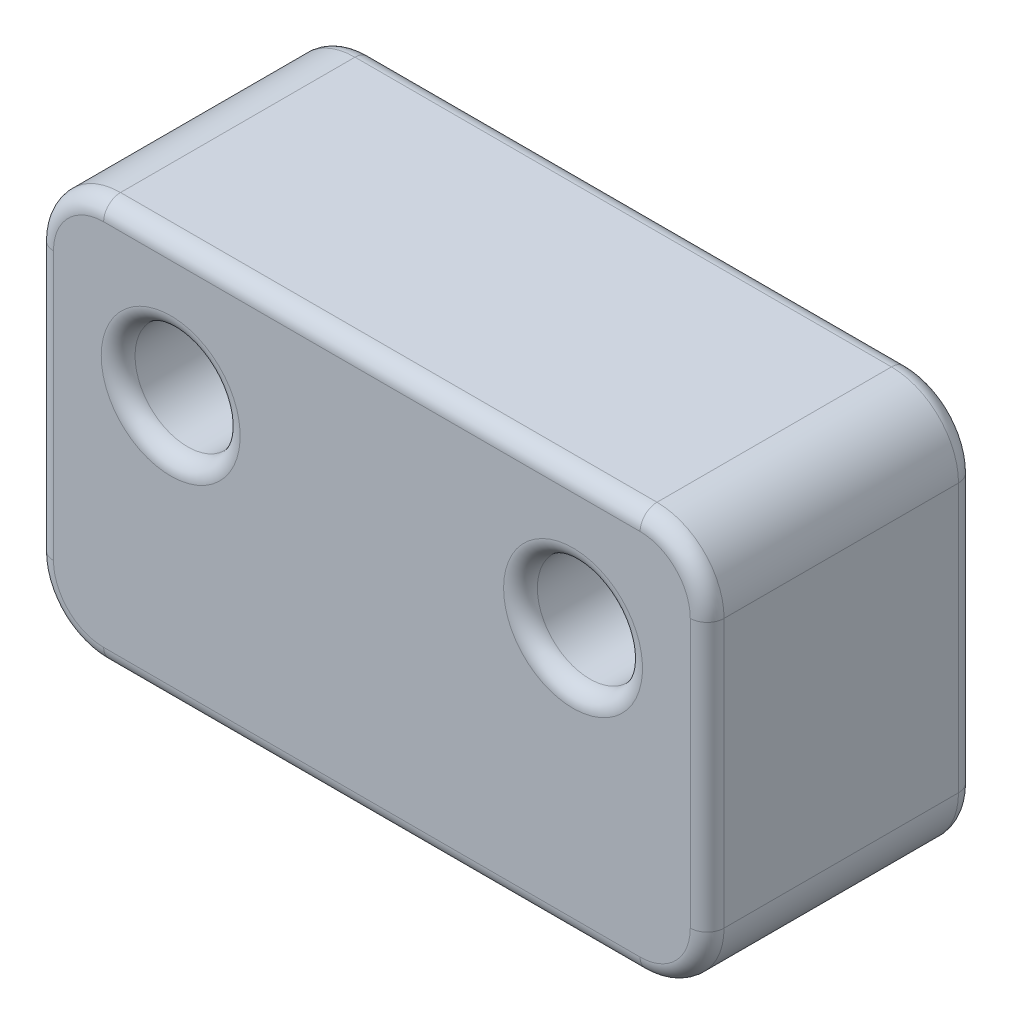
ISO-10303-21;
HEADER;
FILE_DESCRIPTION(('STEP AP214'),'2;1');
FILE_NAME('part.step','',(''),(''),'','','');
FILE_SCHEMA(('AUTOMOTIVE_DESIGN { 1 0 10303 214 1 1 1 1 }'));
ENDSEC;
DATA;
#1=APPLICATION_CONTEXT('core data for automotive mechanical design processes');
#2=APPLICATION_PROTOCOL_DEFINITION('international standard','automotive_design',2000,#1);
#3=PRODUCT_CONTEXT('',#1,'mechanical');
#4=PRODUCT('Part','Part','',(#3));
#5=PRODUCT_RELATED_PRODUCT_CATEGORY('part','',(#4));
#6=PRODUCT_DEFINITION_FORMATION('','',#4);
#7=PRODUCT_DEFINITION_CONTEXT('part definition',#1,'design');
#8=PRODUCT_DEFINITION('design','',#6,#7);
#9=PRODUCT_DEFINITION_SHAPE('','',#8);
#10=(LENGTH_UNIT() NAMED_UNIT(*) SI_UNIT(.MILLI.,.METRE.));
#11=(NAMED_UNIT(*) PLANE_ANGLE_UNIT() SI_UNIT($,.RADIAN.));
#12=(NAMED_UNIT(*) SI_UNIT($,.STERADIAN.) SOLID_ANGLE_UNIT());
#13=UNCERTAINTY_MEASURE_WITH_UNIT(LENGTH_MEASURE(1.E-05),#10,'distance_accuracy_value','');
#14=(GEOMETRIC_REPRESENTATION_CONTEXT(3) GLOBAL_UNCERTAINTY_ASSIGNED_CONTEXT((#13)) GLOBAL_UNIT_ASSIGNED_CONTEXT((#10,
#11,#12)) REPRESENTATION_CONTEXT('',''));
#15=CARTESIAN_POINT('',(0.,0.,0.));
#16=DIRECTION('',(0.,0.,1.));
#17=DIRECTION('',(1.,0.,0.));
#18=AXIS2_PLACEMENT_3D('',#15,#16,#17);
#19=CARTESIAN_POINT('',(0.,0.,6.35));
#20=DIRECTION('',(0.,0.,-1.));
#21=DIRECTION('',(-1.,0.,0.));
#22=AXIS2_PLACEMENT_3D('',#19,#20,#21);
#23=PLANE('',#22);
#24=CARTESIAN_POINT('',(25.4,12.7,6.35));
#25=DIRECTION('',(0.,0.,-1.));
#26=DIRECTION('',(-1.,0.,0.));
#27=AXIS2_PLACEMENT_3D('',#24,#25,#26);
#28=CIRCLE('',#27,3.2892);
#29=CARTESIAN_POINT('',(22.1108,12.7,6.35));
#30=VERTEX_POINT('',#29);
#31=EDGE_CURVE('E269',#30,#30,#28,.T.);
#32=ORIENTED_EDGE('',*,*,#31,.T.);
#33=EDGE_LOOP('',(#32));
#34=FACE_BOUND('',#33,.T.);
#35=CARTESIAN_POINT('',(6.35,12.7,6.35));
#36=DIRECTION('',(0.,0.,-1.));
#37=DIRECTION('',(-1.,0.,0.));
#38=AXIS2_PLACEMENT_3D('',#35,#36,#37);
#39=CIRCLE('',#38,3.2892);
#40=CARTESIAN_POINT('',(3.0608,12.7,6.35));
#41=VERTEX_POINT('',#40);
#42=EDGE_CURVE('E272',#41,#41,#39,.T.);
#43=ORIENTED_EDGE('',*,*,#42,.T.);
#44=EDGE_LOOP('',(#43));
#45=FACE_BOUND('',#44,.T.);
#46=CARTESIAN_POINT('',(3.175,3.175,6.35));
#47=DIRECTION('',(0.,0.,-1.));
#48=DIRECTION('',(-1.,0.,0.));
#49=AXIS2_PLACEMENT_3D('',#46,#47,#48);
#50=CIRCLE('',#49,2.375);
#51=CARTESIAN_POINT('',(0.8,3.175,6.35));
#52=VERTEX_POINT('',#51);
#53=CARTESIAN_POINT('',(3.175,0.8,6.35));
#54=VERTEX_POINT('',#53);
#55=EDGE_CURVE('E277',#52,#54,#50,.F.);
#56=ORIENTED_EDGE('',*,*,#55,.T.);
#57=DIRECTION('',(1.,0.,0.));
#58=VECTOR('',#57,1.);
#59=CARTESIAN_POINT('',(0.,0.8,6.35));
#60=LINE('',#59,#58);
#61=CARTESIAN_POINT('',(28.575,0.8,6.35));
#62=VERTEX_POINT('',#61);
#63=EDGE_CURVE('E275',#54,#62,#60,.T.);
#64=ORIENTED_EDGE('',*,*,#63,.T.);
#65=CARTESIAN_POINT('',(28.575,3.175,6.35));
#66=DIRECTION('',(0.,0.,-1.));
#67=DIRECTION('',(-1.,0.,0.));
#68=AXIS2_PLACEMENT_3D('',#65,#66,#67);
#69=CIRCLE('',#68,2.375);
#70=CARTESIAN_POINT('',(30.95,3.175,6.35));
#71=VERTEX_POINT('',#70);
#72=EDGE_CURVE('E279',#62,#71,#69,.F.);
#73=ORIENTED_EDGE('',*,*,#72,.T.);
#74=DIRECTION('',(0.,1.,0.));
#75=VECTOR('',#74,1.);
#76=CARTESIAN_POINT('',(30.95,0.,6.35));
#77=LINE('',#76,#75);
#78=CARTESIAN_POINT('',(30.95,15.875,6.35));
#79=VERTEX_POINT('',#78);
#80=EDGE_CURVE('E284',#71,#79,#77,.T.);
#81=ORIENTED_EDGE('',*,*,#80,.T.);
#82=CARTESIAN_POINT('',(28.575,15.875,6.35));
#83=DIRECTION('',(0.,0.,-1.));
#84=DIRECTION('',(-1.,0.,0.));
#85=AXIS2_PLACEMENT_3D('',#82,#83,#84);
#86=CIRCLE('',#85,2.375);
#87=CARTESIAN_POINT('',(28.575,18.25,6.35));
#88=VERTEX_POINT('',#87);
#89=EDGE_CURVE('E288',#79,#88,#86,.F.);
#90=ORIENTED_EDGE('',*,*,#89,.T.);
#91=DIRECTION('',(-1.,0.,0.));
#92=VECTOR('',#91,1.);
#93=CARTESIAN_POINT('',(0.,18.25,6.35));
#94=LINE('',#93,#92);
#95=CARTESIAN_POINT('',(3.175,18.25,6.35));
#96=VERTEX_POINT('',#95);
#97=EDGE_CURVE('E290',#88,#96,#94,.T.);
#98=ORIENTED_EDGE('',*,*,#97,.T.);
#99=CARTESIAN_POINT('',(3.175,15.875,6.35));
#100=DIRECTION('',(0.,0.,-1.));
#101=DIRECTION('',(-1.,0.,0.));
#102=AXIS2_PLACEMENT_3D('',#99,#100,#101);
#103=CIRCLE('',#102,2.375);
#104=CARTESIAN_POINT('',(0.8,15.875,6.35));
#105=VERTEX_POINT('',#104);
#106=EDGE_CURVE('E286',#96,#105,#103,.F.);
#107=ORIENTED_EDGE('',*,*,#106,.T.);
#108=DIRECTION('',(0.,-1.,0.));
#109=VECTOR('',#108,1.);
#110=CARTESIAN_POINT('',(0.8,0.,6.35));
#111=LINE('',#110,#109);
#112=EDGE_CURVE('E281',#105,#52,#111,.T.);
#113=ORIENTED_EDGE('',*,*,#112,.T.);
#114=EDGE_LOOP('',(#56,#64,#73,#81,#90,#98,#107,#113));
#115=FACE_BOUND('',#114,.T.);
#116=ADVANCED_FACE('F41',(#34,#45,#115),#23,.F.);
#117=CARTESIAN_POINT('',(0.,0.,-6.35));
#118=DIRECTION('',(0.,0.,-1.));
#119=DIRECTION('',(-1.,0.,0.));
#120=AXIS2_PLACEMENT_3D('',#117,#118,#119);
#121=PLANE('',#120);
#122=CARTESIAN_POINT('',(25.4,12.7,-6.35));
#123=DIRECTION('',(0.,0.,-1.));
#124=DIRECTION('',(-1.,0.,0.));
#125=AXIS2_PLACEMENT_3D('',#122,#123,#124);
#126=CIRCLE('',#125,3.2892);
#127=CARTESIAN_POINT('',(22.1108,12.7,-6.35));
#128=VERTEX_POINT('',#127);
#129=EDGE_CURVE('E298',#128,#128,#126,.F.);
#130=ORIENTED_EDGE('',*,*,#129,.T.);
#131=EDGE_LOOP('',(#130));
#132=FACE_BOUND('',#131,.T.);
#133=CARTESIAN_POINT('',(6.35,12.7,-6.35));
#134=DIRECTION('',(0.,0.,-1.));
#135=DIRECTION('',(-1.,0.,0.));
#136=AXIS2_PLACEMENT_3D('',#133,#134,#135);
#137=CIRCLE('',#136,3.2892);
#138=CARTESIAN_POINT('',(3.0608,12.7,-6.35));
#139=VERTEX_POINT('',#138);
#140=EDGE_CURVE('E301',#139,#139,#137,.F.);
#141=ORIENTED_EDGE('',*,*,#140,.T.);
#142=EDGE_LOOP('',(#141));
#143=FACE_BOUND('',#142,.T.);
#144=CARTESIAN_POINT('',(28.575,15.875,-6.35));
#145=DIRECTION('',(0.,0.,-1.));
#146=DIRECTION('',(-1.,0.,0.));
#147=AXIS2_PLACEMENT_3D('',#144,#145,#146);
#148=CIRCLE('',#147,2.375);
#149=CARTESIAN_POINT('',(28.575,18.25,-6.35));
#150=VERTEX_POINT('',#149);
#151=CARTESIAN_POINT('',(30.95,15.875,-6.35));
#152=VERTEX_POINT('',#151);
#153=EDGE_CURVE('E308',#150,#152,#148,.T.);
#154=ORIENTED_EDGE('',*,*,#153,.T.);
#155=DIRECTION('',(0.,1.,0.));
#156=VECTOR('',#155,1.);
#157=CARTESIAN_POINT('',(30.95,3.175,-6.35));
#158=LINE('',#157,#156);
#159=CARTESIAN_POINT('',(30.95,3.175,-6.35));
#160=VERTEX_POINT('',#159);
#161=EDGE_CURVE('E304',#152,#160,#158,.F.);
#162=ORIENTED_EDGE('',*,*,#161,.T.);
#163=CARTESIAN_POINT('',(28.575,3.175,-6.35));
#164=DIRECTION('',(0.,0.,-1.));
#165=DIRECTION('',(-1.,0.,0.));
#166=AXIS2_PLACEMENT_3D('',#163,#164,#165);
#167=CIRCLE('',#166,2.375);
#168=CARTESIAN_POINT('',(28.575,0.8,-6.35));
#169=VERTEX_POINT('',#168);
#170=EDGE_CURVE('E306',#160,#169,#167,.T.);
#171=ORIENTED_EDGE('',*,*,#170,.T.);
#172=DIRECTION('',(1.,0.,0.));
#173=VECTOR('',#172,1.);
#174=CARTESIAN_POINT('',(3.175,0.8,-6.35));
#175=LINE('',#174,#173);
#176=CARTESIAN_POINT('',(3.175,0.8,-6.35));
#177=VERTEX_POINT('',#176);
#178=EDGE_CURVE('E165',#169,#177,#175,.F.);
#179=ORIENTED_EDGE('',*,*,#178,.T.);
#180=CARTESIAN_POINT('',(3.175,3.175,-6.35));
#181=DIRECTION('',(0.,0.,-1.));
#182=DIRECTION('',(-1.,0.,0.));
#183=AXIS2_PLACEMENT_3D('',#180,#181,#182);
#184=CIRCLE('',#183,2.375);
#185=CARTESIAN_POINT('',(0.8,3.175,-6.35));
#186=VERTEX_POINT('',#185);
#187=EDGE_CURVE('E159',#177,#186,#184,.T.);
#188=ORIENTED_EDGE('',*,*,#187,.T.);
#189=DIRECTION('',(0.,-1.,0.));
#190=VECTOR('',#189,1.);
#191=CARTESIAN_POINT('',(0.8,15.875,-6.35));
#192=LINE('',#191,#190);
#193=CARTESIAN_POINT('',(0.8,15.875,-6.35));
#194=VERTEX_POINT('',#193);
#195=EDGE_CURVE('E162',#186,#194,#192,.F.);
#196=ORIENTED_EDGE('',*,*,#195,.T.);
#197=CARTESIAN_POINT('',(3.175,15.875,-6.35));
#198=DIRECTION('',(0.,0.,-1.));
#199=DIRECTION('',(-1.,0.,0.));
#200=AXIS2_PLACEMENT_3D('',#197,#198,#199);
#201=CIRCLE('',#200,2.375);
#202=CARTESIAN_POINT('',(3.175,18.25,-6.35));
#203=VERTEX_POINT('',#202);
#204=EDGE_CURVE('E169',#194,#203,#201,.T.);
#205=ORIENTED_EDGE('',*,*,#204,.T.);
#206=DIRECTION('',(-1.,0.,0.));
#207=VECTOR('',#206,1.);
#208=CARTESIAN_POINT('',(28.575,18.25,-6.35));
#209=LINE('',#208,#207);
#210=EDGE_CURVE('E311',#203,#150,#209,.F.);
#211=ORIENTED_EDGE('',*,*,#210,.T.);
#212=EDGE_LOOP('',(#154,#162,#171,#179,#188,#196,#205,#211));
#213=FACE_BOUND('',#212,.T.);
#214=ADVANCED_FACE('F161',(#132,#143,#213),#121,.T.);
#215=CARTESIAN_POINT('',(0.,0.,6.35));
#216=DIRECTION('',(1.,0.,0.));
#217=DIRECTION('',(0.,0.,-1.));
#218=AXIS2_PLACEMENT_3D('',#215,#216,#217);
#219=PLANE('',#218);
#220=DIRECTION('',(0.,0.,-1.));
#221=VECTOR('',#220,1.);
#222=CARTESIAN_POINT('',(0.,3.175,6.35));
#223=LINE('',#222,#221);
#224=CARTESIAN_POINT('',(0.,3.175,-5.55));
#225=VERTEX_POINT('',#224);
#226=CARTESIAN_POINT('',(0.,3.175,5.55));
#227=VERTEX_POINT('',#226);
#228=EDGE_CURVE('E180',#225,#227,#223,.F.);
#229=ORIENTED_EDGE('',*,*,#228,.T.);
#230=DIRECTION('',(0.,-1.,0.));
#231=VECTOR('',#230,1.);
#232=CARTESIAN_POINT('',(0.,0.,5.55));
#233=LINE('',#232,#231);
#234=CARTESIAN_POINT('',(0.,15.875,5.55));
#235=VERTEX_POINT('',#234);
#236=EDGE_CURVE('E245',#227,#235,#233,.F.);
#237=ORIENTED_EDGE('',*,*,#236,.T.);
#238=DIRECTION('',(0.,0.,-1.));
#239=VECTOR('',#238,1.);
#240=CARTESIAN_POINT('',(0.,15.875,6.35));
#241=LINE('',#240,#239);
#242=CARTESIAN_POINT('',(0.,15.875,-5.55));
#243=VERTEX_POINT('',#242);
#244=EDGE_CURVE('E316',#235,#243,#241,.T.);
#245=ORIENTED_EDGE('',*,*,#244,.T.);
#246=DIRECTION('',(0.,-1.,0.));
#247=VECTOR('',#246,1.);
#248=CARTESIAN_POINT('',(0.,3.175,-5.55));
#249=LINE('',#248,#247);
#250=EDGE_CURVE('E248',#243,#225,#249,.T.);
#251=ORIENTED_EDGE('',*,*,#250,.T.);
#252=EDGE_LOOP('',(#229,#237,#245,#251));
#253=FACE_BOUND('',#252,.T.);
#254=ADVANCED_FACE('F390',(#253),#219,.F.);
#255=CARTESIAN_POINT('',(0.,0.,6.35));
#256=DIRECTION('',(0.,1.,0.));
#257=DIRECTION('',(0.,0.,1.));
#258=AXIS2_PLACEMENT_3D('',#255,#256,#257);
#259=PLANE('',#258);
#260=DIRECTION('',(0.,0.,-1.));
#261=VECTOR('',#260,1.);
#262=CARTESIAN_POINT('',(3.175,0.,6.35));
#263=LINE('',#262,#261);
#264=CARTESIAN_POINT('',(3.175,0.,5.55));
#265=VERTEX_POINT('',#264);
#266=CARTESIAN_POINT('',(3.175,0.,-5.55));
#267=VERTEX_POINT('',#266);
#268=EDGE_CURVE('E321',#265,#267,#263,.T.);
#269=ORIENTED_EDGE('',*,*,#268,.T.);
#270=DIRECTION('',(1.,0.,0.));
#271=VECTOR('',#270,1.);
#272=CARTESIAN_POINT('',(28.575,0.,-5.55));
#273=LINE('',#272,#271);
#274=CARTESIAN_POINT('',(28.575,0.,-5.55));
#275=VERTEX_POINT('',#274);
#276=EDGE_CURVE('E258',#267,#275,#273,.T.);
#277=ORIENTED_EDGE('',*,*,#276,.T.);
#278=DIRECTION('',(0.,0.,-1.));
#279=VECTOR('',#278,1.);
#280=CARTESIAN_POINT('',(28.575,0.,6.35));
#281=LINE('',#280,#279);
#282=CARTESIAN_POINT('',(28.575,0.,5.55));
#283=VERTEX_POINT('',#282);
#284=EDGE_CURVE('E318',#275,#283,#281,.F.);
#285=ORIENTED_EDGE('',*,*,#284,.T.);
#286=DIRECTION('',(1.,0.,0.));
#287=VECTOR('',#286,1.);
#288=CARTESIAN_POINT('',(0.,0.,5.55));
#289=LINE('',#288,#287);
#290=EDGE_CURVE('E261',#283,#265,#289,.F.);
#291=ORIENTED_EDGE('',*,*,#290,.T.);
#292=EDGE_LOOP('',(#269,#277,#285,#291));
#293=FACE_BOUND('',#292,.T.);
#294=ADVANCED_FACE('F368',(#293),#259,.F.);
#295=CARTESIAN_POINT('',(31.75,0.,6.35));
#296=DIRECTION('',(-1.,0.,0.));
#297=DIRECTION('',(0.,0.,1.));
#298=AXIS2_PLACEMENT_3D('',#295,#296,#297);
#299=PLANE('',#298);
#300=DIRECTION('',(0.,0.,-1.));
#301=VECTOR('',#300,1.);
#302=CARTESIAN_POINT('',(31.75,3.175,6.35));
#303=LINE('',#302,#301);
#304=CARTESIAN_POINT('',(31.75,3.175,5.55));
#305=VERTEX_POINT('',#304);
#306=CARTESIAN_POINT('',(31.75,3.175,-5.55));
#307=VERTEX_POINT('',#306);
#308=EDGE_CURVE('E327',#305,#307,#303,.T.);
#309=ORIENTED_EDGE('',*,*,#308,.T.);
#310=DIRECTION('',(0.,1.,0.));
#311=VECTOR('',#310,1.);
#312=CARTESIAN_POINT('',(31.75,15.875,-5.55));
#313=LINE('',#312,#311);
#314=CARTESIAN_POINT('',(31.75,15.875,-5.55));
#315=VERTEX_POINT('',#314);
#316=EDGE_CURVE('E254',#307,#315,#313,.T.);
#317=ORIENTED_EDGE('',*,*,#316,.T.);
#318=DIRECTION('',(0.,0.,-1.));
#319=VECTOR('',#318,1.);
#320=CARTESIAN_POINT('',(31.75,15.875,6.35));
#321=LINE('',#320,#319);
#322=CARTESIAN_POINT('',(31.75,15.875,5.55));
#323=VERTEX_POINT('',#322);
#324=EDGE_CURVE('E324',#315,#323,#321,.F.);
#325=ORIENTED_EDGE('',*,*,#324,.T.);
#326=DIRECTION('',(0.,1.,0.));
#327=VECTOR('',#326,1.);
#328=CARTESIAN_POINT('',(31.75,0.,5.55));
#329=LINE('',#328,#327);
#330=EDGE_CURVE('E256',#323,#305,#329,.F.);
#331=ORIENTED_EDGE('',*,*,#330,.T.);
#332=EDGE_LOOP('',(#309,#317,#325,#331));
#333=FACE_BOUND('',#332,.T.);
#334=ADVANCED_FACE('F357',(#333),#299,.F.);
#335=CARTESIAN_POINT('',(0.,19.05,6.35));
#336=DIRECTION('',(0.,-1.,0.));
#337=DIRECTION('',(0.,0.,-1.));
#338=AXIS2_PLACEMENT_3D('',#335,#336,#337);
#339=PLANE('',#338);
#340=DIRECTION('',(0.,0.,-1.));
#341=VECTOR('',#340,1.);
#342=CARTESIAN_POINT('',(28.575,19.05,6.35));
#343=LINE('',#342,#341);
#344=CARTESIAN_POINT('',(28.575,19.05,5.55));
#345=VERTEX_POINT('',#344);
#346=CARTESIAN_POINT('',(28.575,19.05,-5.55));
#347=VERTEX_POINT('',#346);
#348=EDGE_CURVE('E330',#345,#347,#343,.T.);
#349=ORIENTED_EDGE('',*,*,#348,.T.);
#350=DIRECTION('',(-1.,0.,0.));
#351=VECTOR('',#350,1.);
#352=CARTESIAN_POINT('',(3.175,19.05,-5.55));
#353=LINE('',#352,#351);
#354=CARTESIAN_POINT('',(3.175,19.05,-5.55));
#355=VERTEX_POINT('',#354);
#356=EDGE_CURVE('E250',#347,#355,#353,.T.);
#357=ORIENTED_EDGE('',*,*,#356,.T.);
#358=DIRECTION('',(0.,0.,-1.));
#359=VECTOR('',#358,1.);
#360=CARTESIAN_POINT('',(3.175,19.05,6.35));
#361=LINE('',#360,#359);
#362=CARTESIAN_POINT('',(3.175,19.05,5.55));
#363=VERTEX_POINT('',#362);
#364=EDGE_CURVE('E201',#355,#363,#361,.F.);
#365=ORIENTED_EDGE('',*,*,#364,.T.);
#366=DIRECTION('',(-1.,0.,0.));
#367=VECTOR('',#366,1.);
#368=CARTESIAN_POINT('',(0.,19.05,5.55));
#369=LINE('',#368,#367);
#370=EDGE_CURVE('E252',#363,#345,#369,.F.);
#371=ORIENTED_EDGE('',*,*,#370,.T.);
#372=EDGE_LOOP('',(#349,#357,#365,#371));
#373=FACE_BOUND('',#372,.T.);
#374=ADVANCED_FACE('F336',(#373),#339,.F.);
#375=CARTESIAN_POINT('',(6.35,12.7,6.35));
#376=DIRECTION('',(0.,0.,-1.));
#377=DIRECTION('',(-1.,0.,0.));
#378=AXIS2_PLACEMENT_3D('',#375,#376,#377);
#379=CYLINDRICAL_SURFACE('',#378,2.4892);
#380=CARTESIAN_POINT('',(6.35,12.7,-5.55));
#381=DIRECTION('',(0.,0.,-1.));
#382=DIRECTION('',(-1.,0.,0.));
#383=AXIS2_PLACEMENT_3D('',#380,#381,#382);
#384=CIRCLE('',#383,2.4892);
#385=CARTESIAN_POINT('',(3.8608,12.7,-5.55));
#386=VERTEX_POINT('',#385);
#387=EDGE_CURVE('E263',#386,#386,#384,.T.);
#388=ORIENTED_EDGE('',*,*,#387,.T.);
#389=EDGE_LOOP('',(#388));
#390=FACE_BOUND('',#389,.T.);
#391=CARTESIAN_POINT('',(6.35,12.7,5.55));
#392=DIRECTION('',(0.,0.,-1.));
#393=DIRECTION('',(-1.,0.,0.));
#394=AXIS2_PLACEMENT_3D('',#391,#392,#393);
#395=CIRCLE('',#394,2.4892);
#396=CARTESIAN_POINT('',(3.8608,12.7,5.55));
#397=VERTEX_POINT('',#396);
#398=EDGE_CURVE('E266',#397,#397,#395,.F.);
#399=ORIENTED_EDGE('',*,*,#398,.T.);
#400=EDGE_LOOP('',(#399));
#401=FACE_BOUND('',#400,.T.);
#402=ADVANCED_FACE('F422',(#390,#401),#379,.F.);
#403=CARTESIAN_POINT('',(25.4,12.7,6.35));
#404=DIRECTION('',(0.,0.,-1.));
#405=DIRECTION('',(-1.,0.,0.));
#406=AXIS2_PLACEMENT_3D('',#403,#404,#405);
#407=CYLINDRICAL_SURFACE('',#406,2.4892);
#408=CARTESIAN_POINT('',(25.4,12.7,-5.55));
#409=DIRECTION('',(0.,0.,-1.));
#410=DIRECTION('',(-1.,0.,0.));
#411=AXIS2_PLACEMENT_3D('',#408,#409,#410);
#412=CIRCLE('',#411,2.4892);
#413=CARTESIAN_POINT('',(22.9108,12.7,-5.55));
#414=VERTEX_POINT('',#413);
#415=EDGE_CURVE('E292',#414,#414,#412,.T.);
#416=ORIENTED_EDGE('',*,*,#415,.T.);
#417=EDGE_LOOP('',(#416));
#418=FACE_BOUND('',#417,.T.);
#419=CARTESIAN_POINT('',(25.4,12.7,5.55));
#420=DIRECTION('',(0.,0.,-1.));
#421=DIRECTION('',(-1.,0.,0.));
#422=AXIS2_PLACEMENT_3D('',#419,#420,#421);
#423=CIRCLE('',#422,2.4892);
#424=CARTESIAN_POINT('',(22.9108,12.7,5.55));
#425=VERTEX_POINT('',#424);
#426=EDGE_CURVE('E295',#425,#425,#423,.F.);
#427=ORIENTED_EDGE('',*,*,#426,.T.);
#428=EDGE_LOOP('',(#427));
#429=FACE_BOUND('',#428,.T.);
#430=ADVANCED_FACE('F435',(#418,#429),#407,.F.);
#431=CARTESIAN_POINT('',(28.575,15.875,6.35));
#432=DIRECTION('',(0.,0.,-1.));
#433=DIRECTION('',(-1.,0.,0.));
#434=AXIS2_PLACEMENT_3D('',#431,#432,#433);
#435=CYLINDRICAL_SURFACE('',#434,3.175);
#436=ORIENTED_EDGE('',*,*,#324,.F.);
#437=CARTESIAN_POINT('',(28.575,15.875,-5.55));
#438=DIRECTION('',(0.,0.,-1.));
#439=DIRECTION('',(-1.,0.,0.));
#440=AXIS2_PLACEMENT_3D('',#437,#438,#439);
#441=CIRCLE('',#440,3.175);
#442=EDGE_CURVE('E11',#315,#347,#441,.F.);
#443=ORIENTED_EDGE('',*,*,#442,.T.);
#444=ORIENTED_EDGE('',*,*,#348,.F.);
#445=CARTESIAN_POINT('',(28.575,15.875,5.55));
#446=DIRECTION('',(0.,0.,-1.));
#447=DIRECTION('',(-1.,0.,0.));
#448=AXIS2_PLACEMENT_3D('',#445,#446,#447);
#449=CIRCLE('',#448,3.175);
#450=EDGE_CURVE('E50',#345,#323,#449,.T.);
#451=ORIENTED_EDGE('',*,*,#450,.T.);
#452=EDGE_LOOP('',(#436,#443,#444,#451));
#453=FACE_BOUND('',#452,.T.);
#454=ADVANCED_FACE('F353',(#453),#435,.T.);
#455=CARTESIAN_POINT('',(28.575,3.175,6.35));
#456=DIRECTION('',(0.,0.,-1.));
#457=DIRECTION('',(-1.,0.,0.));
#458=AXIS2_PLACEMENT_3D('',#455,#456,#457);
#459=CYLINDRICAL_SURFACE('',#458,3.175);
#460=ORIENTED_EDGE('',*,*,#284,.F.);
#461=CARTESIAN_POINT('',(28.575,3.175,-5.55));
#462=DIRECTION('',(0.,0.,-1.));
#463=DIRECTION('',(-1.,0.,0.));
#464=AXIS2_PLACEMENT_3D('',#461,#462,#463);
#465=CIRCLE('',#464,3.175);
#466=EDGE_CURVE('E235',#275,#307,#465,.F.);
#467=ORIENTED_EDGE('',*,*,#466,.T.);
#468=ORIENTED_EDGE('',*,*,#308,.F.);
#469=CARTESIAN_POINT('',(28.575,3.175,5.55));
#470=DIRECTION('',(0.,0.,-1.));
#471=DIRECTION('',(-1.,0.,0.));
#472=AXIS2_PLACEMENT_3D('',#469,#470,#471);
#473=CIRCLE('',#472,3.175);
#474=EDGE_CURVE('E237',#305,#283,#473,.T.);
#475=ORIENTED_EDGE('',*,*,#474,.T.);
#476=EDGE_LOOP('',(#460,#467,#468,#475));
#477=FACE_BOUND('',#476,.T.);
#478=ADVANCED_FACE('F366',(#477),#459,.T.);
#479=CARTESIAN_POINT('',(3.175,3.175,6.35));
#480=DIRECTION('',(0.,0.,-1.));
#481=DIRECTION('',(-1.,0.,0.));
#482=AXIS2_PLACEMENT_3D('',#479,#480,#481);
#483=CYLINDRICAL_SURFACE('',#482,3.175);
#484=ORIENTED_EDGE('',*,*,#228,.F.);
#485=CARTESIAN_POINT('',(3.175,3.175,-5.55));
#486=DIRECTION('',(0.,0.,-1.));
#487=DIRECTION('',(-1.,0.,0.));
#488=AXIS2_PLACEMENT_3D('',#485,#486,#487);
#489=CIRCLE('',#488,3.175);
#490=EDGE_CURVE('E183',#225,#267,#489,.F.);
#491=ORIENTED_EDGE('',*,*,#490,.T.);
#492=ORIENTED_EDGE('',*,*,#268,.F.);
#493=CARTESIAN_POINT('',(3.175,3.175,5.55));
#494=DIRECTION('',(0.,0.,-1.));
#495=DIRECTION('',(-1.,0.,0.));
#496=AXIS2_PLACEMENT_3D('',#493,#494,#495);
#497=CIRCLE('',#496,3.175);
#498=EDGE_CURVE('E240',#265,#227,#497,.T.);
#499=ORIENTED_EDGE('',*,*,#498,.T.);
#500=EDGE_LOOP('',(#484,#491,#492,#499));
#501=FACE_BOUND('',#500,.T.);
#502=ADVANCED_FACE('F392',(#501),#483,.T.);
#503=CARTESIAN_POINT('',(3.175,15.875,6.35));
#504=DIRECTION('',(0.,0.,-1.));
#505=DIRECTION('',(-1.,0.,0.));
#506=AXIS2_PLACEMENT_3D('',#503,#504,#505);
#507=CYLINDRICAL_SURFACE('',#506,3.175);
#508=ORIENTED_EDGE('',*,*,#364,.F.);
#509=CARTESIAN_POINT('',(3.175,15.875,-5.55));
#510=DIRECTION('',(0.,0.,-1.));
#511=DIRECTION('',(-1.,0.,0.));
#512=AXIS2_PLACEMENT_3D('',#509,#510,#511);
#513=CIRCLE('',#512,3.175);
#514=EDGE_CURVE('E58',#355,#243,#513,.F.);
#515=ORIENTED_EDGE('',*,*,#514,.T.);
#516=ORIENTED_EDGE('',*,*,#244,.F.);
#517=CARTESIAN_POINT('',(3.175,15.875,5.55));
#518=DIRECTION('',(0.,0.,-1.));
#519=DIRECTION('',(-1.,0.,0.));
#520=AXIS2_PLACEMENT_3D('',#517,#518,#519);
#521=CIRCLE('',#520,3.175);
#522=EDGE_CURVE('E243',#235,#363,#521,.T.);
#523=ORIENTED_EDGE('',*,*,#522,.T.);
#524=EDGE_LOOP('',(#508,#515,#516,#523));
#525=FACE_BOUND('',#524,.T.);
#526=ADVANCED_FACE('F400',(#525),#507,.T.);
#527=CARTESIAN_POINT('',(25.4,12.7,-5.55));
#528=DIRECTION('',(0.,0.,-1.));
#529=DIRECTION('',(-1.,0.,0.));
#530=AXIS2_PLACEMENT_3D('',#527,#528,#529);
#531=TOROIDAL_SURFACE('',#530,3.2892,0.8);
#532=ORIENTED_EDGE('',*,*,#415,.F.);
#533=EDGE_LOOP('',(#532));
#534=FACE_BOUND('',#533,.T.);
#535=ORIENTED_EDGE('',*,*,#129,.F.);
#536=EDGE_LOOP('',(#535));
#537=FACE_BOUND('',#536,.T.);
#538=ADVANCED_FACE('F402',(#534,#537),#531,.T.);
#539=CARTESIAN_POINT('',(25.4,12.7,5.55));
#540=DIRECTION('',(0.,0.,-1.));
#541=DIRECTION('',(-1.,0.,0.));
#542=AXIS2_PLACEMENT_3D('',#539,#540,#541);
#543=TOROIDAL_SURFACE('',#542,3.2892,0.8);
#544=ORIENTED_EDGE('',*,*,#31,.F.);
#545=EDGE_LOOP('',(#544));
#546=FACE_BOUND('',#545,.T.);
#547=ORIENTED_EDGE('',*,*,#426,.F.);
#548=EDGE_LOOP('',(#547));
#549=FACE_BOUND('',#548,.T.);
#550=ADVANCED_FACE('F408',(#546,#549),#543,.T.);
#551=CARTESIAN_POINT('',(6.35,12.7,-5.55));
#552=DIRECTION('',(0.,0.,-1.));
#553=DIRECTION('',(-1.,0.,0.));
#554=AXIS2_PLACEMENT_3D('',#551,#552,#553);
#555=TOROIDAL_SURFACE('',#554,3.2892,0.8);
#556=ORIENTED_EDGE('',*,*,#387,.F.);
#557=EDGE_LOOP('',(#556));
#558=FACE_BOUND('',#557,.T.);
#559=ORIENTED_EDGE('',*,*,#140,.F.);
#560=EDGE_LOOP('',(#559));
#561=FACE_BOUND('',#560,.T.);
#562=ADVANCED_FACE('F467',(#558,#561),#555,.T.);
#563=CARTESIAN_POINT('',(6.35,12.7,5.55));
#564=DIRECTION('',(0.,0.,-1.));
#565=DIRECTION('',(-1.,0.,0.));
#566=AXIS2_PLACEMENT_3D('',#563,#564,#565);
#567=TOROIDAL_SURFACE('',#566,3.2892,0.8);
#568=ORIENTED_EDGE('',*,*,#42,.F.);
#569=EDGE_LOOP('',(#568));
#570=FACE_BOUND('',#569,.T.);
#571=ORIENTED_EDGE('',*,*,#398,.F.);
#572=EDGE_LOOP('',(#571));
#573=FACE_BOUND('',#572,.T.);
#574=ADVANCED_FACE('F477',(#570,#573),#567,.T.);
#575=CARTESIAN_POINT('',(0.,18.25,-5.55));
#576=DIRECTION('',(1.,0.,0.));
#577=DIRECTION('',(0.,0.,-1.));
#578=AXIS2_PLACEMENT_3D('',#575,#576,#577);
#579=CYLINDRICAL_SURFACE('',#578,0.8);
#580=CARTESIAN_POINT('',(28.575,18.25,-5.55));
#581=DIRECTION('',(1.,0.,0.));
#582=DIRECTION('',(0.,0.,-1.));
#583=AXIS2_PLACEMENT_3D('',#580,#581,#582);
#584=CIRCLE('',#583,0.8);
#585=EDGE_CURVE('E195',#150,#347,#584,.T.);
#586=ORIENTED_EDGE('',*,*,#585,.F.);
#587=ORIENTED_EDGE('',*,*,#210,.F.);
#588=CARTESIAN_POINT('',(3.175,18.25,-5.55));
#589=DIRECTION('',(-1.,0.,0.));
#590=DIRECTION('',(0.,0.,1.));
#591=AXIS2_PLACEMENT_3D('',#588,#589,#590);
#592=CIRCLE('',#591,0.8);
#593=EDGE_CURVE('E198',#355,#203,#592,.T.);
#594=ORIENTED_EDGE('',*,*,#593,.F.);
#595=ORIENTED_EDGE('',*,*,#356,.F.);
#596=EDGE_LOOP('',(#586,#587,#594,#595));
#597=FACE_BOUND('',#596,.T.);
#598=ADVANCED_FACE('F384',(#597),#579,.T.);
#599=CARTESIAN_POINT('',(3.175,15.875,-5.55));
#600=DIRECTION('',(0.,0.,-1.));
#601=DIRECTION('',(-1.,0.,0.));
#602=AXIS2_PLACEMENT_3D('',#599,#600,#601);
#603=TOROIDAL_SURFACE('',#602,2.375,0.8);
#604=ORIENTED_EDGE('',*,*,#593,.T.);
#605=ORIENTED_EDGE('',*,*,#204,.F.);
#606=CARTESIAN_POINT('',(0.8,15.875,-5.55));
#607=DIRECTION('',(0.,-1.,0.));
#608=DIRECTION('',(0.,0.,-1.));
#609=AXIS2_PLACEMENT_3D('',#606,#607,#608);
#610=CIRCLE('',#609,0.8);
#611=EDGE_CURVE('E179',#243,#194,#610,.T.);
#612=ORIENTED_EDGE('',*,*,#611,.F.);
#613=ORIENTED_EDGE('',*,*,#514,.F.);
#614=EDGE_LOOP('',(#604,#605,#612,#613));
#615=FACE_BOUND('',#614,.T.);
#616=ADVANCED_FACE('F387',(#615),#603,.T.);
#617=CARTESIAN_POINT('',(28.575,15.875,-5.55));
#618=DIRECTION('',(0.,0.,-1.));
#619=DIRECTION('',(-1.,0.,0.));
#620=AXIS2_PLACEMENT_3D('',#617,#618,#619);
#621=TOROIDAL_SURFACE('',#620,2.375,0.8);
#622=ORIENTED_EDGE('',*,*,#585,.T.);
#623=ORIENTED_EDGE('',*,*,#442,.F.);
#624=CARTESIAN_POINT('',(30.95,15.875,-5.55));
#625=DIRECTION('',(0.,-1.,0.));
#626=DIRECTION('',(0.,0.,-1.));
#627=AXIS2_PLACEMENT_3D('',#624,#625,#626);
#628=CIRCLE('',#627,0.8);
#629=EDGE_CURVE('E184',#152,#315,#628,.T.);
#630=ORIENTED_EDGE('',*,*,#629,.F.);
#631=ORIENTED_EDGE('',*,*,#153,.F.);
#632=EDGE_LOOP('',(#622,#623,#630,#631));
#633=FACE_BOUND('',#632,.T.);
#634=ADVANCED_FACE('F381',(#633),#621,.T.);
#635=CARTESIAN_POINT('',(0.8,0.,-5.55));
#636=DIRECTION('',(0.,1.,0.));
#637=DIRECTION('',(0.,0.,1.));
#638=AXIS2_PLACEMENT_3D('',#635,#636,#637);
#639=CYLINDRICAL_SURFACE('',#638,0.8);
#640=ORIENTED_EDGE('',*,*,#611,.T.);
#641=ORIENTED_EDGE('',*,*,#195,.F.);
#642=CARTESIAN_POINT('',(0.8,3.175,-5.55));
#643=DIRECTION('',(0.,-1.,0.));
#644=DIRECTION('',(0.,0.,-1.));
#645=AXIS2_PLACEMENT_3D('',#642,#643,#644);
#646=CIRCLE('',#645,0.8);
#647=EDGE_CURVE('E176',#225,#186,#646,.T.);
#648=ORIENTED_EDGE('',*,*,#647,.F.);
#649=ORIENTED_EDGE('',*,*,#250,.F.);
#650=EDGE_LOOP('',(#640,#641,#648,#649));
#651=FACE_BOUND('',#650,.T.);
#652=ADVANCED_FACE('F174',(#651),#639,.T.);
#653=CARTESIAN_POINT('',(30.95,0.,-5.55));
#654=DIRECTION('',(0.,-1.,0.));
#655=DIRECTION('',(0.,0.,-1.));
#656=AXIS2_PLACEMENT_3D('',#653,#654,#655);
#657=CYLINDRICAL_SURFACE('',#656,0.8);
#658=ORIENTED_EDGE('',*,*,#629,.T.);
#659=ORIENTED_EDGE('',*,*,#316,.F.);
#660=CARTESIAN_POINT('',(30.95,3.175,-5.55));
#661=DIRECTION('',(0.,-1.,0.));
#662=DIRECTION('',(0.,0.,-1.));
#663=AXIS2_PLACEMENT_3D('',#660,#661,#662);
#664=CIRCLE('',#663,0.8);
#665=EDGE_CURVE('E185',#160,#307,#664,.T.);
#666=ORIENTED_EDGE('',*,*,#665,.F.);
#667=ORIENTED_EDGE('',*,*,#161,.F.);
#668=EDGE_LOOP('',(#658,#659,#666,#667));
#669=FACE_BOUND('',#668,.T.);
#670=ADVANCED_FACE('F376',(#669),#657,.T.);
#671=CARTESIAN_POINT('',(3.175,3.175,-5.55));
#672=DIRECTION('',(0.,0.,-1.));
#673=DIRECTION('',(-1.,0.,0.));
#674=AXIS2_PLACEMENT_3D('',#671,#672,#673);
#675=TOROIDAL_SURFACE('',#674,2.375,0.8);
#676=ORIENTED_EDGE('',*,*,#647,.T.);
#677=ORIENTED_EDGE('',*,*,#187,.F.);
#678=CARTESIAN_POINT('',(3.175,0.8,-5.55));
#679=DIRECTION('',(1.,0.,0.));
#680=DIRECTION('',(0.,0.,-1.));
#681=AXIS2_PLACEMENT_3D('',#678,#679,#680);
#682=CIRCLE('',#681,0.8);
#683=EDGE_CURVE('E190',#267,#177,#682,.T.);
#684=ORIENTED_EDGE('',*,*,#683,.F.);
#685=ORIENTED_EDGE('',*,*,#490,.F.);
#686=EDGE_LOOP('',(#676,#677,#684,#685));
#687=FACE_BOUND('',#686,.T.);
#688=ADVANCED_FACE('F182',(#687),#675,.T.);
#689=CARTESIAN_POINT('',(28.575,3.175,-5.55));
#690=DIRECTION('',(0.,0.,-1.));
#691=DIRECTION('',(-1.,0.,0.));
#692=AXIS2_PLACEMENT_3D('',#689,#690,#691);
#693=TOROIDAL_SURFACE('',#692,2.375,0.8);
#694=ORIENTED_EDGE('',*,*,#665,.T.);
#695=ORIENTED_EDGE('',*,*,#466,.F.);
#696=CARTESIAN_POINT('',(28.575,0.8,-5.55));
#697=DIRECTION('',(-1.,0.,0.));
#698=DIRECTION('',(0.,0.,1.));
#699=AXIS2_PLACEMENT_3D('',#696,#697,#698);
#700=CIRCLE('',#699,0.8);
#701=EDGE_CURVE('E223',#169,#275,#700,.T.);
#702=ORIENTED_EDGE('',*,*,#701,.F.);
#703=ORIENTED_EDGE('',*,*,#170,.F.);
#704=EDGE_LOOP('',(#694,#695,#702,#703));
#705=FACE_BOUND('',#704,.T.);
#706=ADVANCED_FACE('F373',(#705),#693,.T.);
#707=CARTESIAN_POINT('',(0.,0.8,-5.55));
#708=DIRECTION('',(-1.,0.,0.));
#709=DIRECTION('',(0.,0.,1.));
#710=AXIS2_PLACEMENT_3D('',#707,#708,#709);
#711=CYLINDRICAL_SURFACE('',#710,0.8);
#712=ORIENTED_EDGE('',*,*,#683,.T.);
#713=ORIENTED_EDGE('',*,*,#178,.F.);
#714=ORIENTED_EDGE('',*,*,#701,.T.);
#715=ORIENTED_EDGE('',*,*,#276,.F.);
#716=EDGE_LOOP('',(#712,#713,#714,#715));
#717=FACE_BOUND('',#716,.T.);
#718=ADVANCED_FACE('F370',(#717),#711,.T.);
#719=CARTESIAN_POINT('',(30.95,0.,5.55));
#720=DIRECTION('',(0.,1.,0.));
#721=DIRECTION('',(0.,0.,1.));
#722=AXIS2_PLACEMENT_3D('',#719,#720,#721);
#723=CYLINDRICAL_SURFACE('',#722,0.8);
#724=CARTESIAN_POINT('',(30.95,3.175,5.55));
#725=DIRECTION('',(0.,-1.,0.));
#726=DIRECTION('',(0.,0.,-1.));
#727=AXIS2_PLACEMENT_3D('',#724,#725,#726);
#728=CIRCLE('',#727,0.8);
#729=EDGE_CURVE('E216',#305,#71,#728,.T.);
#730=ORIENTED_EDGE('',*,*,#729,.F.);
#731=ORIENTED_EDGE('',*,*,#330,.F.);
#732=CARTESIAN_POINT('',(30.95,15.875,5.55));
#733=DIRECTION('',(0.,1.,0.));
#734=DIRECTION('',(0.,0.,1.));
#735=AXIS2_PLACEMENT_3D('',#732,#733,#734);
#736=CIRCLE('',#735,0.8);
#737=EDGE_CURVE('E45',#79,#323,#736,.T.);
#738=ORIENTED_EDGE('',*,*,#737,.F.);
#739=ORIENTED_EDGE('',*,*,#80,.F.);
#740=EDGE_LOOP('',(#730,#731,#738,#739));
#741=FACE_BOUND('',#740,.T.);
#742=ADVANCED_FACE('F43',(#741),#723,.T.);
#743=CARTESIAN_POINT('',(28.575,15.875,5.55));
#744=DIRECTION('',(0.,0.,-1.));
#745=DIRECTION('',(-1.,0.,0.));
#746=AXIS2_PLACEMENT_3D('',#743,#744,#745);
#747=TOROIDAL_SURFACE('',#746,2.375,0.8);
#748=ORIENTED_EDGE('',*,*,#737,.T.);
#749=ORIENTED_EDGE('',*,*,#450,.F.);
#750=CARTESIAN_POINT('',(28.575,18.25,5.55));
#751=DIRECTION('',(-1.,0.,0.));
#752=DIRECTION('',(0.,0.,1.));
#753=AXIS2_PLACEMENT_3D('',#750,#751,#752);
#754=CIRCLE('',#753,0.8);
#755=EDGE_CURVE('E214',#88,#345,#754,.T.);
#756=ORIENTED_EDGE('',*,*,#755,.F.);
#757=ORIENTED_EDGE('',*,*,#89,.F.);
#758=EDGE_LOOP('',(#748,#749,#756,#757));
#759=FACE_BOUND('',#758,.T.);
#760=ADVANCED_FACE('F350',(#759),#747,.T.);
#761=CARTESIAN_POINT('',(28.575,3.175,5.55));
#762=DIRECTION('',(0.,0.,-1.));
#763=DIRECTION('',(-1.,0.,0.));
#764=AXIS2_PLACEMENT_3D('',#761,#762,#763);
#765=TOROIDAL_SURFACE('',#764,2.375,0.8);
#766=ORIENTED_EDGE('',*,*,#729,.T.);
#767=ORIENTED_EDGE('',*,*,#72,.F.);
#768=CARTESIAN_POINT('',(28.575,0.8,5.55));
#769=DIRECTION('',(-1.,0.,0.));
#770=DIRECTION('',(0.,0.,1.));
#771=AXIS2_PLACEMENT_3D('',#768,#769,#770);
#772=CIRCLE('',#771,0.8);
#773=EDGE_CURVE('E211',#283,#62,#772,.T.);
#774=ORIENTED_EDGE('',*,*,#773,.F.);
#775=ORIENTED_EDGE('',*,*,#474,.F.);
#776=EDGE_LOOP('',(#766,#767,#774,#775));
#777=FACE_BOUND('',#776,.T.);
#778=ADVANCED_FACE('F362',(#777),#765,.T.);
#779=CARTESIAN_POINT('',(0.,18.25,5.55));
#780=DIRECTION('',(-1.,0.,0.));
#781=DIRECTION('',(0.,0.,1.));
#782=AXIS2_PLACEMENT_3D('',#779,#780,#781);
#783=CYLINDRICAL_SURFACE('',#782,0.8);
#784=ORIENTED_EDGE('',*,*,#755,.T.);
#785=ORIENTED_EDGE('',*,*,#370,.F.);
#786=CARTESIAN_POINT('',(3.175,18.25,5.55));
#787=DIRECTION('',(-1.,0.,0.));
#788=DIRECTION('',(0.,0.,1.));
#789=AXIS2_PLACEMENT_3D('',#786,#787,#788);
#790=CIRCLE('',#789,0.8);
#791=EDGE_CURVE('E208',#96,#363,#790,.T.);
#792=ORIENTED_EDGE('',*,*,#791,.F.);
#793=ORIENTED_EDGE('',*,*,#97,.F.);
#794=EDGE_LOOP('',(#784,#785,#792,#793));
#795=FACE_BOUND('',#794,.T.);
#796=ADVANCED_FACE('F342',(#795),#783,.T.);
#797=CARTESIAN_POINT('',(0.,0.8,5.55));
#798=DIRECTION('',(1.,0.,0.));
#799=DIRECTION('',(0.,0.,-1.));
#800=AXIS2_PLACEMENT_3D('',#797,#798,#799);
#801=CYLINDRICAL_SURFACE('',#800,0.8);
#802=ORIENTED_EDGE('',*,*,#773,.T.);
#803=ORIENTED_EDGE('',*,*,#63,.F.);
#804=CARTESIAN_POINT('',(3.175,0.8,5.55));
#805=DIRECTION('',(-1.,0.,0.));
#806=DIRECTION('',(0.,0.,1.));
#807=AXIS2_PLACEMENT_3D('',#804,#805,#806);
#808=CIRCLE('',#807,0.8);
#809=EDGE_CURVE('E205',#265,#54,#808,.T.);
#810=ORIENTED_EDGE('',*,*,#809,.F.);
#811=ORIENTED_EDGE('',*,*,#290,.F.);
#812=EDGE_LOOP('',(#802,#803,#810,#811));
#813=FACE_BOUND('',#812,.T.);
#814=ADVANCED_FACE('F582',(#813),#801,.T.);
#815=CARTESIAN_POINT('',(3.175,15.875,5.55));
#816=DIRECTION('',(0.,0.,-1.));
#817=DIRECTION('',(-1.,0.,0.));
#818=AXIS2_PLACEMENT_3D('',#815,#816,#817);
#819=TOROIDAL_SURFACE('',#818,2.375,0.8);
#820=ORIENTED_EDGE('',*,*,#791,.T.);
#821=ORIENTED_EDGE('',*,*,#522,.F.);
#822=CARTESIAN_POINT('',(0.8,15.875,5.55));
#823=DIRECTION('',(0.,-1.,0.));
#824=DIRECTION('',(0.,0.,-1.));
#825=AXIS2_PLACEMENT_3D('',#822,#823,#824);
#826=CIRCLE('',#825,0.8);
#827=EDGE_CURVE('E66',#105,#235,#826,.T.);
#828=ORIENTED_EDGE('',*,*,#827,.F.);
#829=ORIENTED_EDGE('',*,*,#106,.F.);
#830=EDGE_LOOP('',(#820,#821,#828,#829));
#831=FACE_BOUND('',#830,.T.);
#832=ADVANCED_FACE('F347',(#831),#819,.T.);
#833=CARTESIAN_POINT('',(3.175,3.175,5.55));
#834=DIRECTION('',(0.,0.,-1.));
#835=DIRECTION('',(-1.,0.,0.));
#836=AXIS2_PLACEMENT_3D('',#833,#834,#835);
#837=TOROIDAL_SURFACE('',#836,2.375,0.8);
#838=ORIENTED_EDGE('',*,*,#809,.T.);
#839=ORIENTED_EDGE('',*,*,#55,.F.);
#840=CARTESIAN_POINT('',(0.8,3.175,5.55));
#841=DIRECTION('',(0.,1.,0.));
#842=DIRECTION('',(0.,0.,1.));
#843=AXIS2_PLACEMENT_3D('',#840,#841,#842);
#844=CIRCLE('',#843,0.8);
#845=EDGE_CURVE('E202',#227,#52,#844,.T.);
#846=ORIENTED_EDGE('',*,*,#845,.F.);
#847=ORIENTED_EDGE('',*,*,#498,.F.);
#848=EDGE_LOOP('',(#838,#839,#846,#847));
#849=FACE_BOUND('',#848,.T.);
#850=ADVANCED_FACE('F397',(#849),#837,.T.);
#851=CARTESIAN_POINT('',(0.8,0.,5.55));
#852=DIRECTION('',(0.,-1.,0.));
#853=DIRECTION('',(0.,0.,-1.));
#854=AXIS2_PLACEMENT_3D('',#851,#852,#853);
#855=CYLINDRICAL_SURFACE('',#854,0.8);
#856=ORIENTED_EDGE('',*,*,#827,.T.);
#857=ORIENTED_EDGE('',*,*,#236,.F.);
#858=ORIENTED_EDGE('',*,*,#845,.T.);
#859=ORIENTED_EDGE('',*,*,#112,.F.);
#860=EDGE_LOOP('',(#856,#857,#858,#859));
#861=FACE_BOUND('',#860,.T.);
#862=ADVANCED_FACE('F399',(#861),#855,.T.);
#863=CLOSED_SHELL('',(#116,#214,#254,#294,#334,#374,#402,#430,#454,#478,#502,#526,#538,#550,
#562,#574,#598,#616,#634,#652,#670,#688,#706,#718,#742,#760,#778,#796,#814,#832,#850,#862));
#864=MANIFOLD_SOLID_BREP('B2',#863);
#865=ADVANCED_BREP_SHAPE_REPRESENTATION('',(#18,#864),#14);
#866=SHAPE_DEFINITION_REPRESENTATION(#9,#865);
ENDSEC;
END-ISO-10303-21;
